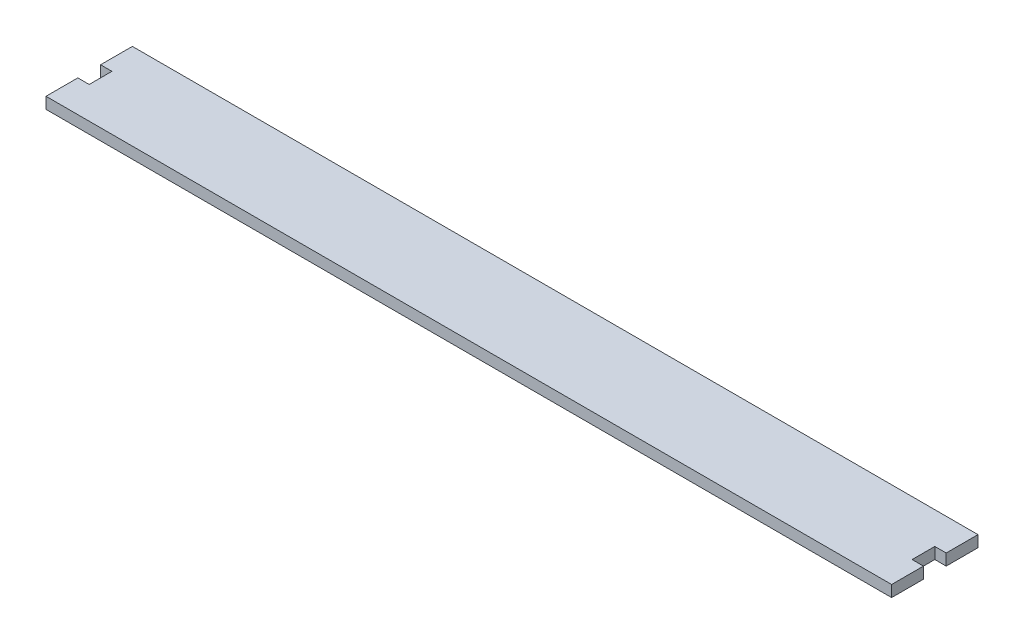
ISO-10303-21;
HEADER;
FILE_DESCRIPTION(('STEP AP214'),'2;1');
FILE_NAME('part.step','',(''),(''),'','','');
FILE_SCHEMA(('AUTOMOTIVE_DESIGN { 1 0 10303 214 1 1 1 1 }'));
ENDSEC;
DATA;
#1=APPLICATION_CONTEXT('core data for automotive mechanical design processes');
#2=APPLICATION_PROTOCOL_DEFINITION('international standard','automotive_design',2000,#1);
#3=PRODUCT_CONTEXT('',#1,'mechanical');
#4=PRODUCT('Part','Part','',(#3));
#5=PRODUCT_RELATED_PRODUCT_CATEGORY('part','',(#4));
#6=PRODUCT_DEFINITION_FORMATION('','',#4);
#7=PRODUCT_DEFINITION_CONTEXT('part definition',#1,'design');
#8=PRODUCT_DEFINITION('design','',#6,#7);
#9=PRODUCT_DEFINITION_SHAPE('','',#8);
#10=(LENGTH_UNIT() NAMED_UNIT(*) SI_UNIT(.MILLI.,.METRE.));
#11=(NAMED_UNIT(*) PLANE_ANGLE_UNIT() SI_UNIT($,.RADIAN.));
#12=(NAMED_UNIT(*) SI_UNIT($,.STERADIAN.) SOLID_ANGLE_UNIT());
#13=UNCERTAINTY_MEASURE_WITH_UNIT(LENGTH_MEASURE(1.E-05),#10,'distance_accuracy_value','');
#14=(GEOMETRIC_REPRESENTATION_CONTEXT(3) GLOBAL_UNCERTAINTY_ASSIGNED_CONTEXT((#13)) GLOBAL_UNIT_ASSIGNED_CONTEXT((#10,
#11,#12)) REPRESENTATION_CONTEXT('',''));
#15=CARTESIAN_POINT('',(0.,0.,0.));
#16=DIRECTION('',(0.,0.,1.));
#17=DIRECTION('',(1.,0.,0.));
#18=AXIS2_PLACEMENT_3D('',#15,#16,#17);
#19=CARTESIAN_POINT('',(-186.,5.,5.00000000000001));
#20=DIRECTION('',(1.,0.,0.));
#21=DIRECTION('',(0.,0.,-1.));
#22=AXIS2_PLACEMENT_3D('',#19,#20,#21);
#23=PLANE('',#22);
#24=DIRECTION('',(0.,0.,1.));
#25=VECTOR('',#24,1.);
#26=CARTESIAN_POINT('',(-186.,0.,5.00000000000001));
#27=LINE('',#26,#25);
#28=CARTESIAN_POINT('',(-186.,0.,5.00000000000001));
#29=VERTEX_POINT('',#28);
#30=CARTESIAN_POINT('',(-186.,0.,19.));
#31=VERTEX_POINT('',#30);
#32=EDGE_CURVE('E164',#29,#31,#27,.T.);
#33=ORIENTED_EDGE('',*,*,#32,.T.);
#34=DIRECTION('',(0.,-1.,0.));
#35=VECTOR('',#34,1.);
#36=CARTESIAN_POINT('',(-186.,5.,19.));
#37=LINE('',#36,#35);
#38=CARTESIAN_POINT('',(-186.,5.,19.));
#39=VERTEX_POINT('',#38);
#40=EDGE_CURVE('E11',#39,#31,#37,.T.);
#41=ORIENTED_EDGE('',*,*,#40,.F.);
#42=DIRECTION('',(0.,0.,1.));
#43=VECTOR('',#42,1.);
#44=CARTESIAN_POINT('',(-186.,5.,5.00000000000001));
#45=LINE('',#44,#43);
#46=CARTESIAN_POINT('',(-186.,5.,5.00000000000001));
#47=VERTEX_POINT('',#46);
#48=EDGE_CURVE('E198',#47,#39,#45,.T.);
#49=ORIENTED_EDGE('',*,*,#48,.F.);
#50=DIRECTION('',(0.,-1.,0.));
#51=VECTOR('',#50,1.);
#52=CARTESIAN_POINT('',(-186.,5.,5.00000000000001));
#53=LINE('',#52,#51);
#54=EDGE_CURVE('E160',#47,#29,#53,.T.);
#55=ORIENTED_EDGE('',*,*,#54,.T.);
#56=EDGE_LOOP('',(#33,#41,#49,#55));
#57=FACE_BOUND('',#56,.T.);
#58=ADVANCED_FACE('F39',(#57),#23,.F.);
#59=CARTESIAN_POINT('',(186.,5.,19.));
#60=DIRECTION('',(0.,0.,-1.));
#61=DIRECTION('',(-1.,0.,0.));
#62=AXIS2_PLACEMENT_3D('',#59,#60,#61);
#63=PLANE('',#62);
#64=DIRECTION('',(1.,0.,0.));
#65=VECTOR('',#64,1.);
#66=CARTESIAN_POINT('',(186.,0.,19.));
#67=LINE('',#66,#65);
#68=CARTESIAN_POINT('',(186.,0.,19.));
#69=VERTEX_POINT('',#68);
#70=EDGE_CURVE('E168',#31,#69,#67,.T.);
#71=ORIENTED_EDGE('',*,*,#70,.T.);
#72=DIRECTION('',(0.,-1.,0.));
#73=VECTOR('',#72,1.);
#74=CARTESIAN_POINT('',(186.,5.,19.));
#75=LINE('',#74,#73);
#76=CARTESIAN_POINT('',(186.,5.,19.));
#77=VERTEX_POINT('',#76);
#78=EDGE_CURVE('E48',#77,#69,#75,.T.);
#79=ORIENTED_EDGE('',*,*,#78,.F.);
#80=DIRECTION('',(1.,0.,0.));
#81=VECTOR('',#80,1.);
#82=CARTESIAN_POINT('',(186.,5.,19.));
#83=LINE('',#82,#81);
#84=EDGE_CURVE('E111',#39,#77,#83,.T.);
#85=ORIENTED_EDGE('',*,*,#84,.F.);
#86=ORIENTED_EDGE('',*,*,#40,.T.);
#87=EDGE_LOOP('',(#71,#79,#85,#86));
#88=FACE_BOUND('',#87,.T.);
#89=ADVANCED_FACE('F292',(#88),#63,.F.);
#90=CARTESIAN_POINT('',(186.,5.,5.00000000000001));
#91=DIRECTION('',(-1.,0.,0.));
#92=DIRECTION('',(0.,0.,1.));
#93=AXIS2_PLACEMENT_3D('',#90,#91,#92);
#94=PLANE('',#93);
#95=DIRECTION('',(0.,0.,-1.));
#96=VECTOR('',#95,1.);
#97=CARTESIAN_POINT('',(186.,0.,5.00000000000001));
#98=LINE('',#97,#96);
#99=CARTESIAN_POINT('',(186.,0.,5.00000000000001));
#100=VERTEX_POINT('',#99);
#101=EDGE_CURVE('E171',#69,#100,#98,.T.);
#102=ORIENTED_EDGE('',*,*,#101,.T.);
#103=DIRECTION('',(0.,-1.,0.));
#104=VECTOR('',#103,1.);
#105=CARTESIAN_POINT('',(186.,5.,5.00000000000001));
#106=LINE('',#105,#104);
#107=CARTESIAN_POINT('',(186.,5.,5.00000000000001));
#108=VERTEX_POINT('',#107);
#109=EDGE_CURVE('E225',#108,#100,#106,.T.);
#110=ORIENTED_EDGE('',*,*,#109,.F.);
#111=DIRECTION('',(0.,0.,-1.));
#112=VECTOR('',#111,1.);
#113=CARTESIAN_POINT('',(186.,5.,5.00000000000001));
#114=LINE('',#113,#112);
#115=EDGE_CURVE('E235',#77,#108,#114,.T.);
#116=ORIENTED_EDGE('',*,*,#115,.F.);
#117=ORIENTED_EDGE('',*,*,#78,.T.);
#118=EDGE_LOOP('',(#102,#110,#116,#117));
#119=FACE_BOUND('',#118,.T.);
#120=ADVANCED_FACE('F233',(#119),#94,.F.);
#121=CARTESIAN_POINT('',(181.,5.,5.00000000000001));
#122=DIRECTION('',(0.,0.,1.));
#123=DIRECTION('',(1.,0.,0.));
#124=AXIS2_PLACEMENT_3D('',#121,#122,#123);
#125=PLANE('',#124);
#126=DIRECTION('',(-1.,0.,0.));
#127=VECTOR('',#126,1.);
#128=CARTESIAN_POINT('',(181.,0.,5.00000000000001));
#129=LINE('',#128,#127);
#130=CARTESIAN_POINT('',(181.,0.,5.00000000000001));
#131=VERTEX_POINT('',#130);
#132=EDGE_CURVE('E174',#100,#131,#129,.T.);
#133=ORIENTED_EDGE('',*,*,#132,.T.);
#134=DIRECTION('',(0.,-1.,0.));
#135=VECTOR('',#134,1.);
#136=CARTESIAN_POINT('',(181.,5.,5.00000000000001));
#137=LINE('',#136,#135);
#138=CARTESIAN_POINT('',(181.,5.,5.00000000000001));
#139=VERTEX_POINT('',#138);
#140=EDGE_CURVE('E221',#139,#131,#137,.T.);
#141=ORIENTED_EDGE('',*,*,#140,.F.);
#142=DIRECTION('',(-1.,0.,0.));
#143=VECTOR('',#142,1.);
#144=CARTESIAN_POINT('',(181.,5.,5.00000000000001));
#145=LINE('',#144,#143);
#146=EDGE_CURVE('E254',#108,#139,#145,.T.);
#147=ORIENTED_EDGE('',*,*,#146,.F.);
#148=ORIENTED_EDGE('',*,*,#109,.T.);
#149=EDGE_LOOP('',(#133,#141,#147,#148));
#150=FACE_BOUND('',#149,.T.);
#151=ADVANCED_FACE('F244',(#150),#125,.F.);
#152=CARTESIAN_POINT('',(181.,5.,-4.99999999999999));
#153=DIRECTION('',(-1.,0.,0.));
#154=DIRECTION('',(0.,0.,1.));
#155=AXIS2_PLACEMENT_3D('',#152,#153,#154);
#156=PLANE('',#155);
#157=DIRECTION('',(0.,0.,-1.));
#158=VECTOR('',#157,1.);
#159=CARTESIAN_POINT('',(181.,0.,-4.99999999999999));
#160=LINE('',#159,#158);
#161=CARTESIAN_POINT('',(181.,0.,-4.99999999999999));
#162=VERTEX_POINT('',#161);
#163=EDGE_CURVE('E177',#131,#162,#160,.T.);
#164=ORIENTED_EDGE('',*,*,#163,.T.);
#165=DIRECTION('',(0.,-1.,0.));
#166=VECTOR('',#165,1.);
#167=CARTESIAN_POINT('',(181.,5.,-4.99999999999999));
#168=LINE('',#167,#166);
#169=CARTESIAN_POINT('',(181.,5.,-4.99999999999999));
#170=VERTEX_POINT('',#169);
#171=EDGE_CURVE('E217',#170,#162,#168,.T.);
#172=ORIENTED_EDGE('',*,*,#171,.F.);
#173=DIRECTION('',(0.,0.,-1.));
#174=VECTOR('',#173,1.);
#175=CARTESIAN_POINT('',(181.,5.,-4.99999999999999));
#176=LINE('',#175,#174);
#177=EDGE_CURVE('E250',#139,#170,#176,.T.);
#178=ORIENTED_EDGE('',*,*,#177,.F.);
#179=ORIENTED_EDGE('',*,*,#140,.T.);
#180=EDGE_LOOP('',(#164,#172,#178,#179));
#181=FACE_BOUND('',#180,.T.);
#182=ADVANCED_FACE('F248',(#181),#156,.F.);
#183=CARTESIAN_POINT('',(181.,5.,-4.99999999999999));
#184=DIRECTION('',(0.,0.,-1.));
#185=DIRECTION('',(-1.,0.,0.));
#186=AXIS2_PLACEMENT_3D('',#183,#184,#185);
#187=PLANE('',#186);
#188=DIRECTION('',(1.,0.,0.));
#189=VECTOR('',#188,1.);
#190=CARTESIAN_POINT('',(181.,0.,-4.99999999999999));
#191=LINE('',#190,#189);
#192=CARTESIAN_POINT('',(186.,0.,-4.99999999999999));
#193=VERTEX_POINT('',#192);
#194=EDGE_CURVE('E180',#162,#193,#191,.T.);
#195=ORIENTED_EDGE('',*,*,#194,.T.);
#196=DIRECTION('',(0.,-1.,0.));
#197=VECTOR('',#196,1.);
#198=CARTESIAN_POINT('',(186.,5.,-4.99999999999999));
#199=LINE('',#198,#197);
#200=CARTESIAN_POINT('',(186.,5.,-4.99999999999999));
#201=VERTEX_POINT('',#200);
#202=EDGE_CURVE('E213',#201,#193,#199,.T.);
#203=ORIENTED_EDGE('',*,*,#202,.F.);
#204=DIRECTION('',(1.,0.,0.));
#205=VECTOR('',#204,1.);
#206=CARTESIAN_POINT('',(181.,5.,-4.99999999999999));
#207=LINE('',#206,#205);
#208=EDGE_CURVE('E253',#170,#201,#207,.T.);
#209=ORIENTED_EDGE('',*,*,#208,.F.);
#210=ORIENTED_EDGE('',*,*,#171,.T.);
#211=EDGE_LOOP('',(#195,#203,#209,#210));
#212=FACE_BOUND('',#211,.T.);
#213=ADVANCED_FACE('F305',(#212),#187,.F.);
#214=CARTESIAN_POINT('',(186.,5.,-19.));
#215=DIRECTION('',(-1.,0.,0.));
#216=DIRECTION('',(0.,0.,1.));
#217=AXIS2_PLACEMENT_3D('',#214,#215,#216);
#218=PLANE('',#217);
#219=DIRECTION('',(0.,0.,-1.));
#220=VECTOR('',#219,1.);
#221=CARTESIAN_POINT('',(186.,0.,-19.));
#222=LINE('',#221,#220);
#223=CARTESIAN_POINT('',(186.,0.,-19.));
#224=VERTEX_POINT('',#223);
#225=EDGE_CURVE('E183',#193,#224,#222,.T.);
#226=ORIENTED_EDGE('',*,*,#225,.T.);
#227=DIRECTION('',(0.,-1.,0.));
#228=VECTOR('',#227,1.);
#229=CARTESIAN_POINT('',(186.,5.,-19.));
#230=LINE('',#229,#228);
#231=CARTESIAN_POINT('',(186.,5.,-19.));
#232=VERTEX_POINT('',#231);
#233=EDGE_CURVE('E209',#232,#224,#230,.T.);
#234=ORIENTED_EDGE('',*,*,#233,.F.);
#235=DIRECTION('',(0.,0.,-1.));
#236=VECTOR('',#235,1.);
#237=CARTESIAN_POINT('',(186.,5.,-19.));
#238=LINE('',#237,#236);
#239=EDGE_CURVE('E258',#201,#232,#238,.T.);
#240=ORIENTED_EDGE('',*,*,#239,.F.);
#241=ORIENTED_EDGE('',*,*,#202,.T.);
#242=EDGE_LOOP('',(#226,#234,#240,#241));
#243=FACE_BOUND('',#242,.T.);
#244=ADVANCED_FACE('F308',(#243),#218,.F.);
#245=CARTESIAN_POINT('',(186.,5.,-19.));
#246=DIRECTION('',(0.,0.,1.));
#247=DIRECTION('',(1.,0.,0.));
#248=AXIS2_PLACEMENT_3D('',#245,#246,#247);
#249=PLANE('',#248);
#250=DIRECTION('',(-1.,0.,0.));
#251=VECTOR('',#250,1.);
#252=CARTESIAN_POINT('',(186.,0.,-19.));
#253=LINE('',#252,#251);
#254=CARTESIAN_POINT('',(-186.,0.,-19.));
#255=VERTEX_POINT('',#254);
#256=EDGE_CURVE('E186',#224,#255,#253,.T.);
#257=ORIENTED_EDGE('',*,*,#256,.T.);
#258=DIRECTION('',(0.,-1.,0.));
#259=VECTOR('',#258,1.);
#260=CARTESIAN_POINT('',(-186.,5.,-19.));
#261=LINE('',#260,#259);
#262=CARTESIAN_POINT('',(-186.,5.,-19.));
#263=VERTEX_POINT('',#262);
#264=EDGE_CURVE('E205',#263,#255,#261,.T.);
#265=ORIENTED_EDGE('',*,*,#264,.F.);
#266=DIRECTION('',(-1.,0.,0.));
#267=VECTOR('',#266,1.);
#268=CARTESIAN_POINT('',(186.,5.,-19.));
#269=LINE('',#268,#267);
#270=EDGE_CURVE('E265',#232,#263,#269,.T.);
#271=ORIENTED_EDGE('',*,*,#270,.F.);
#272=ORIENTED_EDGE('',*,*,#233,.T.);
#273=EDGE_LOOP('',(#257,#265,#271,#272));
#274=FACE_BOUND('',#273,.T.);
#275=ADVANCED_FACE('F273',(#274),#249,.F.);
#276=CARTESIAN_POINT('',(-186.,5.,-19.));
#277=DIRECTION('',(1.,0.,0.));
#278=DIRECTION('',(0.,0.,-1.));
#279=AXIS2_PLACEMENT_3D('',#276,#277,#278);
#280=PLANE('',#279);
#281=DIRECTION('',(0.,0.,1.));
#282=VECTOR('',#281,1.);
#283=CARTESIAN_POINT('',(-186.,0.,-19.));
#284=LINE('',#283,#282);
#285=CARTESIAN_POINT('',(-186.,0.,-4.99999999999999));
#286=VERTEX_POINT('',#285);
#287=EDGE_CURVE('E189',#255,#286,#284,.T.);
#288=ORIENTED_EDGE('',*,*,#287,.T.);
#289=DIRECTION('',(0.,-1.,0.));
#290=VECTOR('',#289,1.);
#291=CARTESIAN_POINT('',(-186.,5.,-4.99999999999999));
#292=LINE('',#291,#290);
#293=CARTESIAN_POINT('',(-186.,5.,-4.99999999999999));
#294=VERTEX_POINT('',#293);
#295=EDGE_CURVE('E153',#294,#286,#292,.T.);
#296=ORIENTED_EDGE('',*,*,#295,.F.);
#297=DIRECTION('',(0.,0.,1.));
#298=VECTOR('',#297,1.);
#299=CARTESIAN_POINT('',(-186.,5.,-19.));
#300=LINE('',#299,#298);
#301=EDGE_CURVE('E142',#263,#294,#300,.T.);
#302=ORIENTED_EDGE('',*,*,#301,.F.);
#303=ORIENTED_EDGE('',*,*,#264,.T.);
#304=EDGE_LOOP('',(#288,#296,#302,#303));
#305=FACE_BOUND('',#304,.T.);
#306=ADVANCED_FACE('F277',(#305),#280,.F.);
#307=CARTESIAN_POINT('',(-181.,5.,-4.99999999999999));
#308=DIRECTION('',(0.,0.,-1.));
#309=DIRECTION('',(-1.,0.,0.));
#310=AXIS2_PLACEMENT_3D('',#307,#308,#309);
#311=PLANE('',#310);
#312=DIRECTION('',(1.,0.,0.));
#313=VECTOR('',#312,1.);
#314=CARTESIAN_POINT('',(-181.,0.,-4.99999999999999));
#315=LINE('',#314,#313);
#316=CARTESIAN_POINT('',(-181.,0.,-4.99999999999999));
#317=VERTEX_POINT('',#316);
#318=EDGE_CURVE('E151',#286,#317,#315,.T.);
#319=ORIENTED_EDGE('',*,*,#318,.T.);
#320=DIRECTION('',(0.,-1.,0.));
#321=VECTOR('',#320,1.);
#322=CARTESIAN_POINT('',(-181.,5.,-4.99999999999999));
#323=LINE('',#322,#321);
#324=CARTESIAN_POINT('',(-181.,5.,-4.99999999999999));
#325=VERTEX_POINT('',#324);
#326=EDGE_CURVE('E148',#325,#317,#323,.T.);
#327=ORIENTED_EDGE('',*,*,#326,.F.);
#328=DIRECTION('',(1.,0.,0.));
#329=VECTOR('',#328,1.);
#330=CARTESIAN_POINT('',(-181.,5.,-4.99999999999999));
#331=LINE('',#330,#329);
#332=EDGE_CURVE('E136',#294,#325,#331,.T.);
#333=ORIENTED_EDGE('',*,*,#332,.F.);
#334=ORIENTED_EDGE('',*,*,#295,.T.);
#335=EDGE_LOOP('',(#319,#327,#333,#334));
#336=FACE_BOUND('',#335,.T.);
#337=ADVANCED_FACE('F149',(#336),#311,.F.);
#338=CARTESIAN_POINT('',(-181.,5.,-4.99999999999999));
#339=DIRECTION('',(1.,0.,0.));
#340=DIRECTION('',(0.,0.,-1.));
#341=AXIS2_PLACEMENT_3D('',#338,#339,#340);
#342=PLANE('',#341);
#343=DIRECTION('',(0.,0.,1.));
#344=VECTOR('',#343,1.);
#345=CARTESIAN_POINT('',(-181.,0.,-4.99999999999999));
#346=LINE('',#345,#344);
#347=CARTESIAN_POINT('',(-181.,0.,5.00000000000001));
#348=VERTEX_POINT('',#347);
#349=EDGE_CURVE('E97',#317,#348,#346,.T.);
#350=ORIENTED_EDGE('',*,*,#349,.T.);
#351=DIRECTION('',(0.,-1.,0.));
#352=VECTOR('',#351,1.);
#353=CARTESIAN_POINT('',(-181.,5.,5.00000000000001));
#354=LINE('',#353,#352);
#355=CARTESIAN_POINT('',(-181.,5.,5.00000000000001));
#356=VERTEX_POINT('',#355);
#357=EDGE_CURVE('E154',#356,#348,#354,.T.);
#358=ORIENTED_EDGE('',*,*,#357,.F.);
#359=DIRECTION('',(0.,0.,1.));
#360=VECTOR('',#359,1.);
#361=CARTESIAN_POINT('',(-181.,5.,-4.99999999999999));
#362=LINE('',#361,#360);
#363=EDGE_CURVE('E140',#325,#356,#362,.T.);
#364=ORIENTED_EDGE('',*,*,#363,.F.);
#365=ORIENTED_EDGE('',*,*,#326,.T.);
#366=EDGE_LOOP('',(#350,#358,#364,#365));
#367=FACE_BOUND('',#366,.T.);
#368=ADVANCED_FACE('F156',(#367),#342,.F.);
#369=CARTESIAN_POINT('',(-181.,5.,5.00000000000001));
#370=DIRECTION('',(0.,0.,1.));
#371=DIRECTION('',(1.,0.,0.));
#372=AXIS2_PLACEMENT_3D('',#369,#370,#371);
#373=PLANE('',#372);
#374=DIRECTION('',(-1.,0.,0.));
#375=VECTOR('',#374,1.);
#376=CARTESIAN_POINT('',(-181.,0.,5.00000000000001));
#377=LINE('',#376,#375);
#378=EDGE_CURVE('E103',#348,#29,#377,.T.);
#379=ORIENTED_EDGE('',*,*,#378,.T.);
#380=ORIENTED_EDGE('',*,*,#54,.F.);
#381=DIRECTION('',(-1.,0.,0.));
#382=VECTOR('',#381,1.);
#383=CARTESIAN_POINT('',(-181.,5.,5.00000000000001));
#384=LINE('',#383,#382);
#385=EDGE_CURVE('E56',#356,#47,#384,.T.);
#386=ORIENTED_EDGE('',*,*,#385,.F.);
#387=ORIENTED_EDGE('',*,*,#357,.T.);
#388=EDGE_LOOP('',(#379,#380,#386,#387));
#389=FACE_BOUND('',#388,.T.);
#390=ADVANCED_FACE('F281',(#389),#373,.F.);
#391=CARTESIAN_POINT('',(0.,5.,0.));
#392=DIRECTION('',(0.,-1.,0.));
#393=DIRECTION('',(0.,0.,-1.));
#394=AXIS2_PLACEMENT_3D('',#391,#392,#393);
#395=PLANE('',#394);
#396=ORIENTED_EDGE('',*,*,#48,.T.);
#397=ORIENTED_EDGE('',*,*,#84,.T.);
#398=ORIENTED_EDGE('',*,*,#115,.T.);
#399=ORIENTED_EDGE('',*,*,#146,.T.);
#400=ORIENTED_EDGE('',*,*,#177,.T.);
#401=ORIENTED_EDGE('',*,*,#208,.T.);
#402=ORIENTED_EDGE('',*,*,#239,.T.);
#403=ORIENTED_EDGE('',*,*,#270,.T.);
#404=ORIENTED_EDGE('',*,*,#301,.T.);
#405=ORIENTED_EDGE('',*,*,#332,.T.);
#406=ORIENTED_EDGE('',*,*,#363,.T.);
#407=ORIENTED_EDGE('',*,*,#385,.T.);
#408=EDGE_LOOP('',(#396,#397,#398,#399,#400,#401,#402,#403,#404,#405,#406,#407));
#409=FACE_BOUND('',#408,.T.);
#410=ADVANCED_FACE('F138',(#409),#395,.F.);
#411=CARTESIAN_POINT('',(0.,0.,0.));
#412=DIRECTION('',(0.,-1.,0.));
#413=DIRECTION('',(0.,0.,-1.));
#414=AXIS2_PLACEMENT_3D('',#411,#412,#413);
#415=PLANE('',#414);
#416=ORIENTED_EDGE('',*,*,#32,.F.);
#417=ORIENTED_EDGE('',*,*,#378,.F.);
#418=ORIENTED_EDGE('',*,*,#349,.F.);
#419=ORIENTED_EDGE('',*,*,#318,.F.);
#420=ORIENTED_EDGE('',*,*,#287,.F.);
#421=ORIENTED_EDGE('',*,*,#256,.F.);
#422=ORIENTED_EDGE('',*,*,#225,.F.);
#423=ORIENTED_EDGE('',*,*,#194,.F.);
#424=ORIENTED_EDGE('',*,*,#163,.F.);
#425=ORIENTED_EDGE('',*,*,#132,.F.);
#426=ORIENTED_EDGE('',*,*,#101,.F.);
#427=ORIENTED_EDGE('',*,*,#70,.F.);
#428=EDGE_LOOP('',(#416,#417,#418,#419,#420,#421,#422,#423,#424,#425,#426,#427));
#429=FACE_BOUND('',#428,.T.);
#430=ADVANCED_FACE('F239',(#429),#415,.T.);
#431=CLOSED_SHELL('',(#58,#89,#120,#151,#182,#213,#244,#275,#306,#337,#368,#390,#410,#430));
#432=MANIFOLD_SOLID_BREP('B2',#431);
#433=ADVANCED_BREP_SHAPE_REPRESENTATION('',(#18,#432),#14);
#434=SHAPE_DEFINITION_REPRESENTATION(#9,#433);
ENDSEC;
END-ISO-10303-21;
